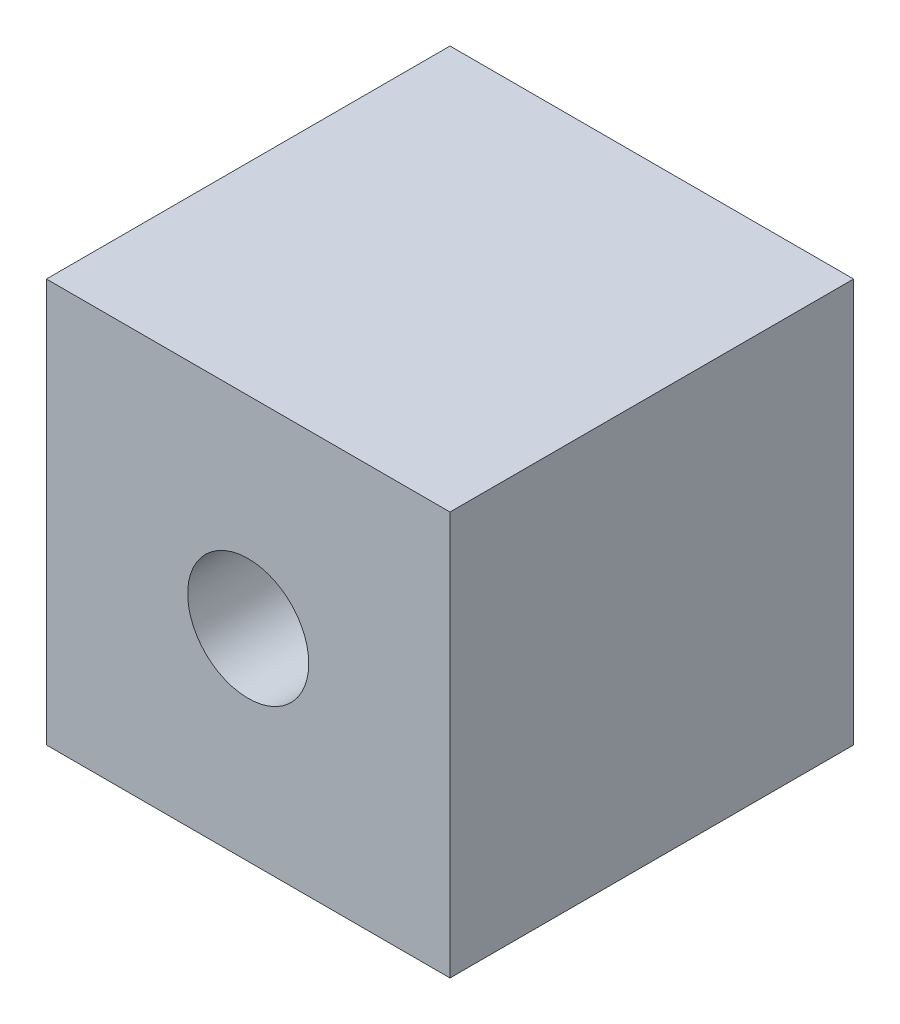
ISO-10303-21;
HEADER;
FILE_DESCRIPTION(('STEP AP214'),'2;1');
FILE_NAME('part.step','',(''),(''),'','','');
FILE_SCHEMA(('AUTOMOTIVE_DESIGN { 1 0 10303 214 1 1 1 1 }'));
ENDSEC;
DATA;
#1=APPLICATION_CONTEXT('core data for automotive mechanical design processes');
#2=APPLICATION_PROTOCOL_DEFINITION('international standard','automotive_design',2000,#1);
#3=PRODUCT_CONTEXT('',#1,'mechanical');
#4=PRODUCT('Part','Part','',(#3));
#5=PRODUCT_RELATED_PRODUCT_CATEGORY('part','',(#4));
#6=PRODUCT_DEFINITION_FORMATION('','',#4);
#7=PRODUCT_DEFINITION_CONTEXT('part definition',#1,'design');
#8=PRODUCT_DEFINITION('design','',#6,#7);
#9=PRODUCT_DEFINITION_SHAPE('','',#8);
#10=(LENGTH_UNIT() NAMED_UNIT(*) SI_UNIT(.MILLI.,.METRE.));
#11=(NAMED_UNIT(*) PLANE_ANGLE_UNIT() SI_UNIT($,.RADIAN.));
#12=(NAMED_UNIT(*) SI_UNIT($,.STERADIAN.) SOLID_ANGLE_UNIT());
#13=UNCERTAINTY_MEASURE_WITH_UNIT(LENGTH_MEASURE(1.E-05),#10,'distance_accuracy_value','');
#14=(GEOMETRIC_REPRESENTATION_CONTEXT(3) GLOBAL_UNCERTAINTY_ASSIGNED_CONTEXT((#13)) GLOBAL_UNIT_ASSIGNED_CONTEXT((#10,
#11,#12)) REPRESENTATION_CONTEXT('',''));
#15=CARTESIAN_POINT('',(0.,0.,0.));
#16=DIRECTION('',(0.,0.,1.));
#17=DIRECTION('',(1.,0.,0.));
#18=AXIS2_PLACEMENT_3D('',#15,#16,#17);
#19=CARTESIAN_POINT('',(0.,0.,10.));
#20=DIRECTION('',(1.,0.,0.));
#21=DIRECTION('',(0.,0.,-1.));
#22=AXIS2_PLACEMENT_3D('',#19,#20,#21);
#23=PLANE('',#22);
#24=DIRECTION('',(0.,-1.,0.));
#25=VECTOR('',#24,1.);
#26=CARTESIAN_POINT('',(0.,0.,0.));
#27=LINE('',#26,#25);
#28=CARTESIAN_POINT('',(0.,10.,0.));
#29=VERTEX_POINT('',#28);
#30=CARTESIAN_POINT('',(0.,0.,0.));
#31=VERTEX_POINT('',#30);
#32=EDGE_CURVE('E98',#29,#31,#27,.T.);
#33=ORIENTED_EDGE('',*,*,#32,.T.);
#34=DIRECTION('',(0.,0.,-1.));
#35=VECTOR('',#34,1.);
#36=CARTESIAN_POINT('',(0.,0.,10.));
#37=LINE('',#36,#35);
#38=CARTESIAN_POINT('',(0.,0.,10.));
#39=VERTEX_POINT('',#38);
#40=EDGE_CURVE('E11',#39,#31,#37,.T.);
#41=ORIENTED_EDGE('',*,*,#40,.F.);
#42=DIRECTION('',(0.,-1.,0.));
#43=VECTOR('',#42,1.);
#44=CARTESIAN_POINT('',(0.,0.,10.));
#45=LINE('',#44,#43);
#46=CARTESIAN_POINT('',(0.,10.,10.));
#47=VERTEX_POINT('',#46);
#48=EDGE_CURVE('E86',#47,#39,#45,.T.);
#49=ORIENTED_EDGE('',*,*,#48,.F.);
#50=DIRECTION('',(0.,0.,-1.));
#51=VECTOR('',#50,1.);
#52=CARTESIAN_POINT('',(0.,10.,10.));
#53=LINE('',#52,#51);
#54=EDGE_CURVE('E94',#47,#29,#53,.T.);
#55=ORIENTED_EDGE('',*,*,#54,.T.);
#56=EDGE_LOOP('',(#33,#41,#49,#55));
#57=FACE_BOUND('',#56,.T.);
#58=ADVANCED_FACE('F35',(#57),#23,.F.);
#59=CARTESIAN_POINT('',(0.,0.,10.));
#60=DIRECTION('',(0.,1.,0.));
#61=DIRECTION('',(0.,0.,1.));
#62=AXIS2_PLACEMENT_3D('',#59,#60,#61);
#63=PLANE('',#62);
#64=DIRECTION('',(1.,0.,0.));
#65=VECTOR('',#64,1.);
#66=CARTESIAN_POINT('',(0.,0.,0.));
#67=LINE('',#66,#65);
#68=CARTESIAN_POINT('',(10.,0.,0.));
#69=VERTEX_POINT('',#68);
#70=EDGE_CURVE('E90',#31,#69,#67,.T.);
#71=ORIENTED_EDGE('',*,*,#70,.T.);
#72=DIRECTION('',(0.,0.,-1.));
#73=VECTOR('',#72,1.);
#74=CARTESIAN_POINT('',(10.,0.,10.));
#75=LINE('',#74,#73);
#76=CARTESIAN_POINT('',(10.,0.,10.));
#77=VERTEX_POINT('',#76);
#78=EDGE_CURVE('E43',#77,#69,#75,.T.);
#79=ORIENTED_EDGE('',*,*,#78,.F.);
#80=DIRECTION('',(1.,0.,0.));
#81=VECTOR('',#80,1.);
#82=CARTESIAN_POINT('',(0.,0.,10.));
#83=LINE('',#82,#81);
#84=EDGE_CURVE('E81',#39,#77,#83,.T.);
#85=ORIENTED_EDGE('',*,*,#84,.F.);
#86=ORIENTED_EDGE('',*,*,#40,.T.);
#87=EDGE_LOOP('',(#71,#79,#85,#86));
#88=FACE_BOUND('',#87,.T.);
#89=ADVANCED_FACE('F89',(#88),#63,.F.);
#90=CARTESIAN_POINT('',(10.,0.,10.));
#91=DIRECTION('',(-1.,0.,0.));
#92=DIRECTION('',(0.,0.,1.));
#93=AXIS2_PLACEMENT_3D('',#90,#91,#92);
#94=PLANE('',#93);
#95=DIRECTION('',(0.,1.,0.));
#96=VECTOR('',#95,1.);
#97=CARTESIAN_POINT('',(10.,0.,0.));
#98=LINE('',#97,#96);
#99=CARTESIAN_POINT('',(10.,10.,0.));
#100=VERTEX_POINT('',#99);
#101=EDGE_CURVE('E68',#69,#100,#98,.T.);
#102=ORIENTED_EDGE('',*,*,#101,.T.);
#103=DIRECTION('',(0.,0.,-1.));
#104=VECTOR('',#103,1.);
#105=CARTESIAN_POINT('',(10.,10.,10.));
#106=LINE('',#105,#104);
#107=CARTESIAN_POINT('',(10.,10.,10.));
#108=VERTEX_POINT('',#107);
#109=EDGE_CURVE('E91',#108,#100,#106,.T.);
#110=ORIENTED_EDGE('',*,*,#109,.F.);
#111=DIRECTION('',(0.,1.,0.));
#112=VECTOR('',#111,1.);
#113=CARTESIAN_POINT('',(10.,0.,10.));
#114=LINE('',#113,#112);
#115=EDGE_CURVE('E84',#77,#108,#114,.T.);
#116=ORIENTED_EDGE('',*,*,#115,.F.);
#117=ORIENTED_EDGE('',*,*,#78,.T.);
#118=EDGE_LOOP('',(#102,#110,#116,#117));
#119=FACE_BOUND('',#118,.T.);
#120=ADVANCED_FACE('F92',(#119),#94,.F.);
#121=CARTESIAN_POINT('',(0.,10.,10.));
#122=DIRECTION('',(0.,-1.,0.));
#123=DIRECTION('',(0.,0.,-1.));
#124=AXIS2_PLACEMENT_3D('',#121,#122,#123);
#125=PLANE('',#124);
#126=DIRECTION('',(-1.,0.,0.));
#127=VECTOR('',#126,1.);
#128=CARTESIAN_POINT('',(0.,10.,0.));
#129=LINE('',#128,#127);
#130=EDGE_CURVE('E74',#100,#29,#129,.T.);
#131=ORIENTED_EDGE('',*,*,#130,.T.);
#132=ORIENTED_EDGE('',*,*,#54,.F.);
#133=DIRECTION('',(-1.,0.,0.));
#134=VECTOR('',#133,1.);
#135=CARTESIAN_POINT('',(0.,10.,10.));
#136=LINE('',#135,#134);
#137=EDGE_CURVE('E51',#108,#47,#136,.T.);
#138=ORIENTED_EDGE('',*,*,#137,.F.);
#139=ORIENTED_EDGE('',*,*,#109,.T.);
#140=EDGE_LOOP('',(#131,#132,#138,#139));
#141=FACE_BOUND('',#140,.T.);
#142=ADVANCED_FACE('F106',(#141),#125,.F.);
#143=CARTESIAN_POINT('',(0.,0.,10.));
#144=DIRECTION('',(0.,0.,-1.));
#145=DIRECTION('',(-1.,0.,0.));
#146=AXIS2_PLACEMENT_3D('',#143,#144,#145);
#147=PLANE('',#146);
#148=CARTESIAN_POINT('',(5.,5.,10.));
#149=DIRECTION('',(0.,0.,1.));
#150=DIRECTION('',(1.,0.,0.));
#151=AXIS2_PLACEMENT_3D('',#148,#149,#150);
#152=CIRCLE('',#151,1.5);
#153=CARTESIAN_POINT('',(6.5,5.,10.));
#154=VERTEX_POINT('',#153);
#155=EDGE_CURVE('E101',#154,#154,#152,.T.);
#156=ORIENTED_EDGE('',*,*,#155,.F.);
#157=EDGE_LOOP('',(#156));
#158=FACE_BOUND('',#157,.T.);
#159=ORIENTED_EDGE('',*,*,#48,.T.);
#160=ORIENTED_EDGE('',*,*,#84,.T.);
#161=ORIENTED_EDGE('',*,*,#115,.T.);
#162=ORIENTED_EDGE('',*,*,#137,.T.);
#163=EDGE_LOOP('',(#159,#160,#161,#162));
#164=FACE_BOUND('',#163,.T.);
#165=ADVANCED_FACE('F82',(#158,#164),#147,.F.);
#166=CARTESIAN_POINT('',(0.,0.,0.));
#167=DIRECTION('',(0.,0.,-1.));
#168=DIRECTION('',(-1.,0.,0.));
#169=AXIS2_PLACEMENT_3D('',#166,#167,#168);
#170=PLANE('',#169);
#171=CARTESIAN_POINT('',(5.,5.,0.));
#172=DIRECTION('',(0.,0.,1.));
#173=DIRECTION('',(1.,0.,0.));
#174=AXIS2_PLACEMENT_3D('',#171,#172,#173);
#175=CIRCLE('',#174,1.5);
#176=CARTESIAN_POINT('',(6.5,5.,0.));
#177=VERTEX_POINT('',#176);
#178=EDGE_CURVE('E112',#177,#177,#175,.T.);
#179=ORIENTED_EDGE('',*,*,#178,.T.);
#180=EDGE_LOOP('',(#179));
#181=FACE_BOUND('',#180,.T.);
#182=ORIENTED_EDGE('',*,*,#32,.F.);
#183=ORIENTED_EDGE('',*,*,#130,.F.);
#184=ORIENTED_EDGE('',*,*,#101,.F.);
#185=ORIENTED_EDGE('',*,*,#70,.F.);
#186=EDGE_LOOP('',(#182,#183,#184,#185));
#187=FACE_BOUND('',#186,.T.);
#188=ADVANCED_FACE('F109',(#181,#187),#170,.T.);
#189=CARTESIAN_POINT('',(5.,5.,10.));
#190=DIRECTION('',(0.,0.,-1.));
#191=DIRECTION('',(-1.,0.,0.));
#192=AXIS2_PLACEMENT_3D('',#189,#190,#191);
#193=CYLINDRICAL_SURFACE('',#192,1.5);
#194=ORIENTED_EDGE('',*,*,#155,.T.);
#195=EDGE_LOOP('',(#194));
#196=FACE_BOUND('',#195,.T.);
#197=ORIENTED_EDGE('',*,*,#178,.F.);
#198=EDGE_LOOP('',(#197));
#199=FACE_BOUND('',#198,.T.);
#200=ADVANCED_FACE('F118',(#196,#199),#193,.F.);
#201=CLOSED_SHELL('',(#58,#89,#120,#142,#165,#188,#200));
#202=MANIFOLD_SOLID_BREP('B2',#201);
#203=ADVANCED_BREP_SHAPE_REPRESENTATION('',(#18,#202),#14);
#204=SHAPE_DEFINITION_REPRESENTATION(#9,#203);
ENDSEC;
END-ISO-10303-21;
